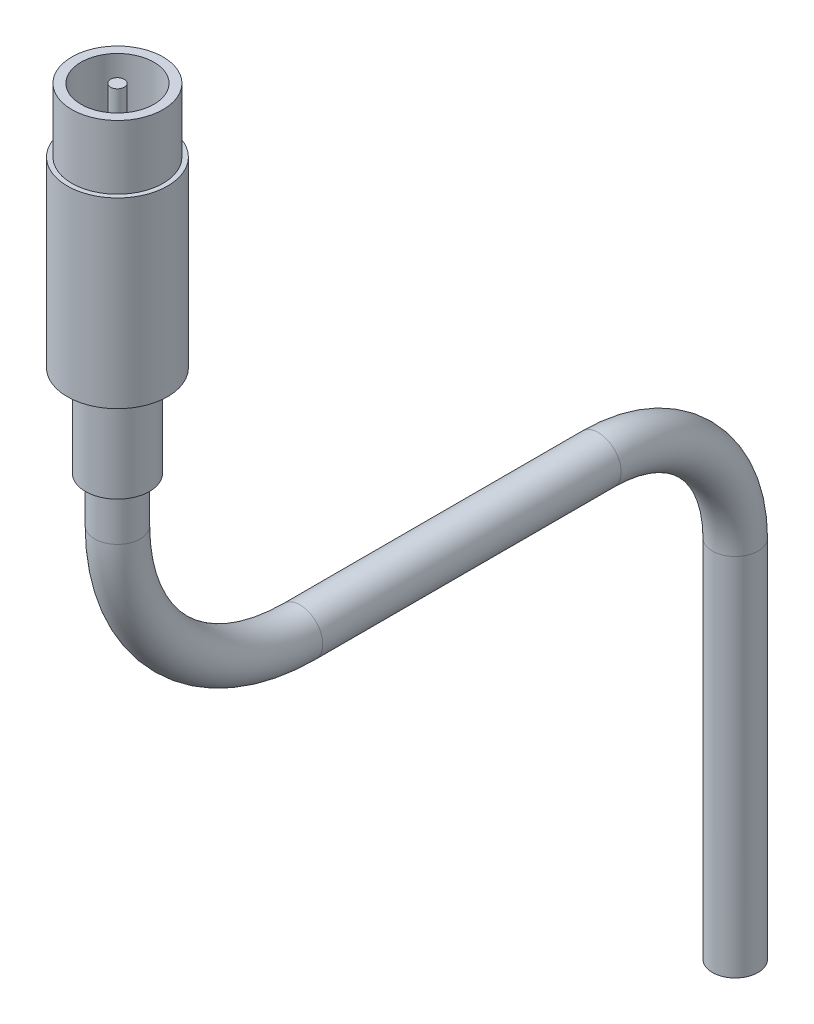
ISO-10303-21;
HEADER;
FILE_DESCRIPTION(('STEP AP214'),'2;1');
FILE_NAME('part.step','',(''),(''),'','','');
FILE_SCHEMA(('AUTOMOTIVE_DESIGN { 1 0 10303 214 1 1 1 1 }'));
ENDSEC;
DATA;
#1=APPLICATION_CONTEXT('core data for automotive mechanical design processes');
#2=APPLICATION_PROTOCOL_DEFINITION('international standard','automotive_design',2000,#1);
#3=PRODUCT_CONTEXT('',#1,'mechanical');
#4=PRODUCT('Part','Part','',(#3));
#5=PRODUCT_RELATED_PRODUCT_CATEGORY('part','',(#4));
#6=PRODUCT_DEFINITION_FORMATION('','',#4);
#7=PRODUCT_DEFINITION_CONTEXT('part definition',#1,'design');
#8=PRODUCT_DEFINITION('design','',#6,#7);
#9=PRODUCT_DEFINITION_SHAPE('','',#8);
#10=(LENGTH_UNIT() NAMED_UNIT(*) SI_UNIT(.MILLI.,.METRE.));
#11=(NAMED_UNIT(*) PLANE_ANGLE_UNIT() SI_UNIT($,.RADIAN.));
#12=(NAMED_UNIT(*) SI_UNIT($,.STERADIAN.) SOLID_ANGLE_UNIT());
#13=UNCERTAINTY_MEASURE_WITH_UNIT(LENGTH_MEASURE(1.E-05),#10,'distance_accuracy_value','');
#14=(GEOMETRIC_REPRESENTATION_CONTEXT(3) GLOBAL_UNCERTAINTY_ASSIGNED_CONTEXT((#13)) GLOBAL_UNIT_ASSIGNED_CONTEXT((#10,
#11,#12)) REPRESENTATION_CONTEXT('',''));
#15=CARTESIAN_POINT('',(0.,0.,0.));
#16=DIRECTION('',(0.,0.,1.));
#17=DIRECTION('',(1.,0.,0.));
#18=AXIS2_PLACEMENT_3D('',#15,#16,#17);
#19=CARTESIAN_POINT('',(0.,-20.,0.));
#20=DIRECTION('',(0.,1.,0.));
#21=DIRECTION('',(0.,0.,1.));
#22=AXIS2_PLACEMENT_3D('',#19,#20,#21);
#23=CYLINDRICAL_SURFACE('',#22,5.5);
#24=CARTESIAN_POINT('',(0.,-20.,0.));
#25=DIRECTION('',(0.,1.,0.));
#26=DIRECTION('',(0.,0.,1.));
#27=AXIS2_PLACEMENT_3D('',#24,#25,#26);
#28=CIRCLE('',#27,5.5);
#29=CARTESIAN_POINT('',(0.,-20.,5.5));
#30=VERTEX_POINT('',#29);
#31=EDGE_CURVE('E55',#30,#30,#28,.T.);
#32=ORIENTED_EDGE('',*,*,#31,.T.);
#33=EDGE_LOOP('',(#32));
#34=FACE_BOUND('',#33,.T.);
#35=CARTESIAN_POINT('',(0.,0.,0.));
#36=DIRECTION('',(0.,1.,0.));
#37=DIRECTION('',(0.,0.,1.));
#38=AXIS2_PLACEMENT_3D('',#35,#36,#37);
#39=CIRCLE('',#38,5.5);
#40=CARTESIAN_POINT('',(0.,0.,5.5));
#41=VERTEX_POINT('',#40);
#42=EDGE_CURVE('E59',#41,#41,#39,.T.);
#43=ORIENTED_EDGE('',*,*,#42,.F.);
#44=EDGE_LOOP('',(#43));
#45=FACE_BOUND('',#44,.T.);
#46=ADVANCED_FACE('F49',(#34,#45),#23,.T.);
#47=CARTESIAN_POINT('',(0.,-20.,0.));
#48=DIRECTION('',(0.,1.,0.));
#49=DIRECTION('',(0.,0.,1.));
#50=AXIS2_PLACEMENT_3D('',#47,#48,#49);
#51=PLANE('',#50);
#52=CARTESIAN_POINT('',(0.,-20.,0.));
#53=DIRECTION('',(0.,1.,0.));
#54=DIRECTION('',(0.,0.,1.));
#55=AXIS2_PLACEMENT_3D('',#52,#53,#54);
#56=CIRCLE('',#55,3.5);
#57=CARTESIAN_POINT('',(0.,-20.,3.5));
#58=VERTEX_POINT('',#57);
#59=EDGE_CURVE('E81',#58,#58,#56,.T.);
#60=ORIENTED_EDGE('',*,*,#59,.T.);
#61=EDGE_LOOP('',(#60));
#62=FACE_BOUND('',#61,.T.);
#63=ORIENTED_EDGE('',*,*,#31,.F.);
#64=EDGE_LOOP('',(#63));
#65=FACE_BOUND('',#64,.T.);
#66=ADVANCED_FACE('F124',(#62,#65),#51,.F.);
#67=CARTESIAN_POINT('',(0.,0.,0.));
#68=DIRECTION('',(0.,1.,0.));
#69=DIRECTION('',(0.,0.,1.));
#70=AXIS2_PLACEMENT_3D('',#67,#68,#69);
#71=PLANE('',#70);
#72=CARTESIAN_POINT('',(0.,0.,0.));
#73=DIRECTION('',(0.,1.,0.));
#74=DIRECTION('',(0.,0.,1.));
#75=AXIS2_PLACEMENT_3D('',#72,#73,#74);
#76=CIRCLE('',#75,5.);
#77=CARTESIAN_POINT('',(0.,0.,5.));
#78=VERTEX_POINT('',#77);
#79=EDGE_CURVE('E66',#78,#78,#76,.T.);
#80=ORIENTED_EDGE('',*,*,#79,.F.);
#81=EDGE_LOOP('',(#80));
#82=FACE_BOUND('',#81,.T.);
#83=ORIENTED_EDGE('',*,*,#42,.T.);
#84=EDGE_LOOP('',(#83));
#85=FACE_BOUND('',#84,.T.);
#86=ADVANCED_FACE('F129',(#82,#85),#71,.T.);
#87=CARTESIAN_POINT('',(0.,7.,0.));
#88=DIRECTION('',(0.,1.,0.));
#89=DIRECTION('',(0.,0.,1.));
#90=AXIS2_PLACEMENT_3D('',#87,#88,#89);
#91=PLANE('',#90);
#92=CARTESIAN_POINT('',(0.,7.,0.));
#93=DIRECTION('',(0.,1.,0.));
#94=DIRECTION('',(0.,0.,1.));
#95=AXIS2_PLACEMENT_3D('',#92,#93,#94);
#96=CIRCLE('',#95,5.);
#97=CARTESIAN_POINT('',(0.,7.,5.));
#98=VERTEX_POINT('',#97);
#99=EDGE_CURVE('E64',#98,#98,#96,.T.);
#100=ORIENTED_EDGE('',*,*,#99,.T.);
#101=EDGE_LOOP('',(#100));
#102=FACE_BOUND('',#101,.T.);
#103=CARTESIAN_POINT('',(0.,7.,0.));
#104=DIRECTION('',(0.,1.,0.));
#105=DIRECTION('',(0.,0.,1.));
#106=AXIS2_PLACEMENT_3D('',#103,#104,#105);
#107=CIRCLE('',#106,4.);
#108=CARTESIAN_POINT('',(0.,7.,4.));
#109=VERTEX_POINT('',#108);
#110=EDGE_CURVE('E69',#109,#109,#107,.T.);
#111=ORIENTED_EDGE('',*,*,#110,.F.);
#112=EDGE_LOOP('',(#111));
#113=FACE_BOUND('',#112,.T.);
#114=ADVANCED_FACE('F135',(#102,#113),#91,.T.);
#115=CARTESIAN_POINT('',(0.,7.,0.));
#116=DIRECTION('',(0.,-1.,0.));
#117=DIRECTION('',(0.,0.,-1.));
#118=AXIS2_PLACEMENT_3D('',#115,#116,#117);
#119=CYLINDRICAL_SURFACE('',#118,5.);
#120=ORIENTED_EDGE('',*,*,#99,.F.);
#121=EDGE_LOOP('',(#120));
#122=FACE_BOUND('',#121,.T.);
#123=ORIENTED_EDGE('',*,*,#79,.T.);
#124=EDGE_LOOP('',(#123));
#125=FACE_BOUND('',#124,.T.);
#126=ADVANCED_FACE('F141',(#122,#125),#119,.T.);
#127=CARTESIAN_POINT('',(0.,7.,0.));
#128=DIRECTION('',(0.,-1.,0.));
#129=DIRECTION('',(0.,0.,-1.));
#130=AXIS2_PLACEMENT_3D('',#127,#128,#129);
#131=CYLINDRICAL_SURFACE('',#130,4.);
#132=ORIENTED_EDGE('',*,*,#110,.T.);
#133=EDGE_LOOP('',(#132));
#134=FACE_BOUND('',#133,.T.);
#135=CARTESIAN_POINT('',(0.,0.,0.));
#136=DIRECTION('',(0.,1.,0.));
#137=DIRECTION('',(0.,0.,1.));
#138=AXIS2_PLACEMENT_3D('',#135,#136,#137);
#139=CIRCLE('',#138,4.);
#140=CARTESIAN_POINT('',(0.,0.,4.));
#141=VERTEX_POINT('',#140);
#142=EDGE_CURVE('E11',#141,#141,#139,.F.);
#143=ORIENTED_EDGE('',*,*,#142,.T.);
#144=EDGE_LOOP('',(#143));
#145=FACE_BOUND('',#144,.T.);
#146=ADVANCED_FACE('F147',(#134,#145),#131,.F.);
#147=CARTESIAN_POINT('',(0.,0.,0.));
#148=DIRECTION('',(0.,1.,0.));
#149=DIRECTION('',(0.,0.,1.));
#150=AXIS2_PLACEMENT_3D('',#147,#148,#149);
#151=CIRCLE('',#150,0.75);
#152=CARTESIAN_POINT('',(0.,0.,0.75));
#153=VERTEX_POINT('',#152);
#154=EDGE_CURVE('E75',#153,#153,#151,.T.);
#155=ORIENTED_EDGE('',*,*,#154,.F.);
#156=EDGE_LOOP('',(#155));
#157=FACE_BOUND('',#156,.T.);
#158=ORIENTED_EDGE('',*,*,#142,.F.);
#159=EDGE_LOOP('',(#158));
#160=FACE_BOUND('',#159,.T.);
#161=ADVANCED_FACE('F137',(#157,#160),#71,.T.);
#162=CARTESIAN_POINT('',(0.,7.,0.));
#163=DIRECTION('',(0.,-1.,0.));
#164=DIRECTION('',(0.,0.,-1.));
#165=AXIS2_PLACEMENT_3D('',#162,#163,#164);
#166=CYLINDRICAL_SURFACE('',#165,0.75);
#167=CARTESIAN_POINT('',(0.,7.,0.));
#168=DIRECTION('',(0.,1.,0.));
#169=DIRECTION('',(0.,0.,1.));
#170=AXIS2_PLACEMENT_3D('',#167,#168,#169);
#171=CIRCLE('',#170,0.75);
#172=CARTESIAN_POINT('',(0.,7.,0.75));
#173=VERTEX_POINT('',#172);
#174=EDGE_CURVE('E74',#173,#173,#171,.T.);
#175=ORIENTED_EDGE('',*,*,#174,.F.);
#176=EDGE_LOOP('',(#175));
#177=FACE_BOUND('',#176,.T.);
#178=ORIENTED_EDGE('',*,*,#154,.T.);
#179=EDGE_LOOP('',(#178));
#180=FACE_BOUND('',#179,.T.);
#181=ADVANCED_FACE('F146',(#177,#180),#166,.T.);
#182=CARTESIAN_POINT('',(0.,7.,0.));
#183=DIRECTION('',(0.,1.,0.));
#184=DIRECTION('',(0.,0.,1.));
#185=AXIS2_PLACEMENT_3D('',#182,#183,#184);
#186=PLANE('',#185);
#187=ORIENTED_EDGE('',*,*,#174,.T.);
#188=EDGE_LOOP('',(#187));
#189=FACE_BOUND('',#188,.T.);
#190=ADVANCED_FACE('F153',(#189),#186,.T.);
#191=CARTESIAN_POINT('',(0.,-30.,0.));
#192=DIRECTION('',(0.,1.,0.));
#193=DIRECTION('',(0.,0.,1.));
#194=AXIS2_PLACEMENT_3D('',#191,#192,#193);
#195=CYLINDRICAL_SURFACE('',#194,3.5);
#196=CARTESIAN_POINT('',(0.,-30.,0.));
#197=DIRECTION('',(0.,1.,0.));
#198=DIRECTION('',(0.,0.,1.));
#199=AXIS2_PLACEMENT_3D('',#196,#197,#198);
#200=CIRCLE('',#199,3.5);
#201=CARTESIAN_POINT('',(0.,-30.,3.5));
#202=VERTEX_POINT('',#201);
#203=EDGE_CURVE('E78',#202,#202,#200,.T.);
#204=ORIENTED_EDGE('',*,*,#203,.T.);
#205=EDGE_LOOP('',(#204));
#206=FACE_BOUND('',#205,.T.);
#207=ORIENTED_EDGE('',*,*,#59,.F.);
#208=EDGE_LOOP('',(#207));
#209=FACE_BOUND('',#208,.T.);
#210=ADVANCED_FACE('F169',(#206,#209),#195,.T.);
#211=CARTESIAN_POINT('',(0.,-30.,0.));
#212=DIRECTION('',(0.,1.,0.));
#213=DIRECTION('',(0.,0.,1.));
#214=AXIS2_PLACEMENT_3D('',#211,#212,#213);
#215=PLANE('',#214);
#216=CARTESIAN_POINT('',(0.,-30.,0.));
#217=DIRECTION('',(0.,1.,0.));
#218=DIRECTION('',(0.,0.,1.));
#219=AXIS2_PLACEMENT_3D('',#216,#217,#218);
#220=CIRCLE('',#219,2.5);
#221=CARTESIAN_POINT('',(0.,-30.,2.5));
#222=VERTEX_POINT('',#221);
#223=EDGE_CURVE('E101',#222,#222,#220,.T.);
#224=ORIENTED_EDGE('',*,*,#223,.T.);
#225=EDGE_LOOP('',(#224));
#226=FACE_BOUND('',#225,.T.);
#227=ORIENTED_EDGE('',*,*,#203,.F.);
#228=EDGE_LOOP('',(#227));
#229=FACE_BOUND('',#228,.T.);
#230=ADVANCED_FACE('F105',(#226,#229),#215,.F.);
#231=CARTESIAN_POINT('',(0.,-110.,-67.7));
#232=DIRECTION('',(0.,1.,0.));
#233=DIRECTION('',(0.,0.,1.));
#234=AXIS2_PLACEMENT_3D('',#231,#232,#233);
#235=PLANE('',#234);
#236=CARTESIAN_POINT('',(0.,-110.,-67.7));
#237=DIRECTION('',(0.,1.,0.));
#238=DIRECTION('',(0.,0.,1.));
#239=AXIS2_PLACEMENT_3D('',#236,#237,#238);
#240=CIRCLE('',#239,2.5);
#241=CARTESIAN_POINT('',(0.,-110.,-65.2));
#242=VERTEX_POINT('',#241);
#243=EDGE_CURVE('E84',#242,#242,#240,.T.);
#244=ORIENTED_EDGE('',*,*,#243,.F.);
#245=EDGE_LOOP('',(#244));
#246=FACE_BOUND('',#245,.T.);
#247=ADVANCED_FACE('F111',(#246),#235,.F.);
#248=CARTESIAN_POINT('',(0.,-30.,0.));
#249=DIRECTION('',(0.,-1.,0.));
#250=DIRECTION('',(0.,0.,-1.));
#251=AXIS2_PLACEMENT_3D('',#248,#249,#250);
#252=CYLINDRICAL_SURFACE('',#251,2.5);
#253=CARTESIAN_POINT('',(0.,-35.,0.));
#254=DIRECTION('',(0.,1.,0.));
#255=DIRECTION('',(0.,0.,1.));
#256=AXIS2_PLACEMENT_3D('',#253,#254,#255);
#257=CIRCLE('',#256,2.5);
#258=CARTESIAN_POINT('',(0.,-35.,2.5));
#259=VERTEX_POINT('',#258);
#260=EDGE_CURVE('E98',#259,#259,#257,.T.);
#261=ORIENTED_EDGE('',*,*,#260,.T.);
#262=EDGE_LOOP('',(#261));
#263=FACE_BOUND('',#262,.T.);
#264=ORIENTED_EDGE('',*,*,#223,.F.);
#265=EDGE_LOOP('',(#264));
#266=FACE_BOUND('',#265,.T.);
#267=ADVANCED_FACE('F108',(#263,#266),#252,.T.);
#268=CARTESIAN_POINT('',(0.,-35.,-20.));
#269=DIRECTION('',(1.,0.,0.));
#270=DIRECTION('',(0.,0.,-1.));
#271=AXIS2_PLACEMENT_3D('',#268,#269,#270);
#272=TOROIDAL_SURFACE('',#271,20.,2.5);
#273=CARTESIAN_POINT('',(0.,-55.,-20.));
#274=DIRECTION('',(0.,0.,1.));
#275=DIRECTION('',(0.,-1.,0.));
#276=AXIS2_PLACEMENT_3D('',#273,#274,#275);
#277=CIRCLE('',#276,2.5);
#278=CARTESIAN_POINT('',(0.,-57.5,-20.));
#279=VERTEX_POINT('',#278);
#280=EDGE_CURVE('E95',#279,#279,#277,.T.);
#281=CARTESIAN_POINT('',(0.,-35.,-20.));
#282=DIRECTION('',(1.,0.,0.));
#283=DIRECTION('',(0.,0.,-1.));
#284=AXIS2_PLACEMENT_3D('',#281,#282,#283);
#285=CIRCLE('',#284,22.5);
#286=EDGE_CURVE('',#259,#279,#285,.T.);
#287=ORIENTED_EDGE('',*,*,#260,.F.);
#288=ORIENTED_EDGE('',*,*,#280,.T.);
#289=ORIENTED_EDGE('',*,*,#286,.T.);
#290=ORIENTED_EDGE('',*,*,#286,.F.);
#291=EDGE_LOOP('',(#287,#289,#288,#290));
#292=FACE_BOUND('',#291,.T.);
#293=ADVANCED_FACE('F110',(#292),#272,.T.);
#294=CARTESIAN_POINT('',(0.,-55.,-20.));
#295=DIRECTION('',(0.,0.,-1.));
#296=DIRECTION('',(-1.,0.,0.));
#297=AXIS2_PLACEMENT_3D('',#294,#295,#296);
#298=CYLINDRICAL_SURFACE('',#297,2.5);
#299=CARTESIAN_POINT('',(0.,-55.,-52.7));
#300=DIRECTION('',(0.,0.,1.));
#301=DIRECTION('',(0.,-1.,0.));
#302=AXIS2_PLACEMENT_3D('',#299,#300,#301);
#303=CIRCLE('',#302,2.5);
#304=CARTESIAN_POINT('',(0.,-52.5,-52.7));
#305=VERTEX_POINT('',#304);
#306=EDGE_CURVE('E92',#305,#305,#303,.T.);
#307=ORIENTED_EDGE('',*,*,#306,.T.);
#308=EDGE_LOOP('',(#307));
#309=FACE_BOUND('',#308,.T.);
#310=ORIENTED_EDGE('',*,*,#280,.F.);
#311=EDGE_LOOP('',(#310));
#312=FACE_BOUND('',#311,.T.);
#313=ADVANCED_FACE('F118',(#309,#312),#298,.T.);
#314=CARTESIAN_POINT('',(0.,-70.,-52.7));
#315=DIRECTION('',(-1.,0.,0.));
#316=DIRECTION('',(0.,0.,1.));
#317=AXIS2_PLACEMENT_3D('',#314,#315,#316);
#318=TOROIDAL_SURFACE('',#317,15.,2.5);
#319=CARTESIAN_POINT('',(0.,-70.,-67.7));
#320=DIRECTION('',(0.,1.,0.));
#321=DIRECTION('',(0.,0.,1.));
#322=AXIS2_PLACEMENT_3D('',#319,#320,#321);
#323=CIRCLE('',#322,2.5);
#324=CARTESIAN_POINT('',(0.,-70.,-70.2));
#325=VERTEX_POINT('',#324);
#326=EDGE_CURVE('E89',#325,#325,#323,.T.);
#327=CARTESIAN_POINT('',(0.,-70.,-52.7));
#328=DIRECTION('',(-1.,0.,0.));
#329=DIRECTION('',(0.,0.,1.));
#330=AXIS2_PLACEMENT_3D('',#327,#328,#329);
#331=CIRCLE('',#330,17.5);
#332=EDGE_CURVE('',#305,#325,#331,.T.);
#333=ORIENTED_EDGE('',*,*,#306,.F.);
#334=ORIENTED_EDGE('',*,*,#326,.T.);
#335=ORIENTED_EDGE('',*,*,#332,.T.);
#336=ORIENTED_EDGE('',*,*,#332,.F.);
#337=EDGE_LOOP('',(#333,#335,#334,#336));
#338=FACE_BOUND('',#337,.T.);
#339=ADVANCED_FACE('F179',(#338),#318,.T.);
#340=CARTESIAN_POINT('',(0.,-70.,-67.7));
#341=DIRECTION('',(0.,-1.,0.));
#342=DIRECTION('',(0.,0.,-1.));
#343=AXIS2_PLACEMENT_3D('',#340,#341,#342);
#344=CYLINDRICAL_SURFACE('',#343,2.5);
#345=ORIENTED_EDGE('',*,*,#243,.T.);
#346=EDGE_LOOP('',(#345));
#347=FACE_BOUND('',#346,.T.);
#348=ORIENTED_EDGE('',*,*,#326,.F.);
#349=EDGE_LOOP('',(#348));
#350=FACE_BOUND('',#349,.T.);
#351=ADVANCED_FACE('F175',(#347,#350),#344,.T.);
#352=CLOSED_SHELL('',(#46,#66,#86,#114,#126,#146,#161,#181,#190,#210,#230,#247,#267,#293,#313,
#339,#351));
#353=MANIFOLD_SOLID_BREP('B2',#352);
#354=ADVANCED_BREP_SHAPE_REPRESENTATION('',(#18,#353),#14);
#355=SHAPE_DEFINITION_REPRESENTATION(#9,#354);
ENDSEC;
END-ISO-10303-21;
